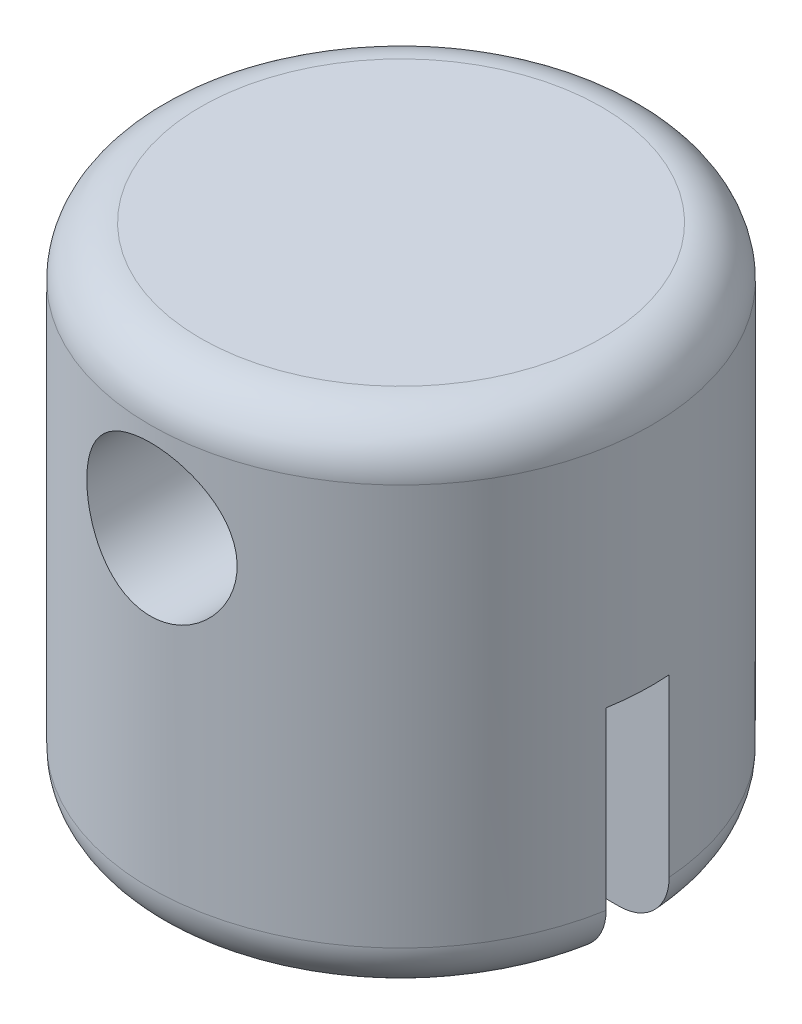
ISO-10303-21;
HEADER;
FILE_DESCRIPTION(('STEP AP214'),'2;1');
FILE_NAME('part.step','',(''),(''),'','','');
FILE_SCHEMA(('AUTOMOTIVE_DESIGN { 1 0 10303 214 1 1 1 1 }'));
ENDSEC;
DATA;
#1=APPLICATION_CONTEXT('core data for automotive mechanical design processes');
#2=APPLICATION_PROTOCOL_DEFINITION('international standard','automotive_design',2000,#1);
#3=PRODUCT_CONTEXT('',#1,'mechanical');
#4=PRODUCT('Part','Part','',(#3));
#5=PRODUCT_RELATED_PRODUCT_CATEGORY('part','',(#4));
#6=PRODUCT_DEFINITION_FORMATION('','',#4);
#7=PRODUCT_DEFINITION_CONTEXT('part definition',#1,'design');
#8=PRODUCT_DEFINITION('design','',#6,#7);
#9=PRODUCT_DEFINITION_SHAPE('','',#8);
#10=(LENGTH_UNIT() NAMED_UNIT(*) SI_UNIT(.MILLI.,.METRE.));
#11=(NAMED_UNIT(*) PLANE_ANGLE_UNIT() SI_UNIT($,.RADIAN.));
#12=(NAMED_UNIT(*) SI_UNIT($,.STERADIAN.) SOLID_ANGLE_UNIT());
#13=UNCERTAINTY_MEASURE_WITH_UNIT(LENGTH_MEASURE(1.E-05),#10,'distance_accuracy_value','');
#14=(GEOMETRIC_REPRESENTATION_CONTEXT(3) GLOBAL_UNCERTAINTY_ASSIGNED_CONTEXT((#13)) GLOBAL_UNIT_ASSIGNED_CONTEXT((#10,
#11,#12)) REPRESENTATION_CONTEXT('',''));
#15=CARTESIAN_POINT('',(0.,0.,0.));
#16=DIRECTION('',(0.,0.,1.));
#17=DIRECTION('',(1.,0.,0.));
#18=AXIS2_PLACEMENT_3D('',#15,#16,#17);
#19=CARTESIAN_POINT('',(0.,0.,0.));
#20=DIRECTION('',(0.,1.,0.));
#21=DIRECTION('',(0.,0.,1.));
#22=AXIS2_PLACEMENT_3D('',#19,#20,#21);
#23=PLANE('',#22);
#24=DIRECTION('',(1.,0.,0.));
#25=VECTOR('',#24,1.);
#26=CARTESIAN_POINT('',(0.,0.,2.12804942041903));
#27=LINE('',#26,#25);
#28=CARTESIAN_POINT('',(-9.93463666493417,0.,2.12804942041903));
#29=VERTEX_POINT('',#28);
#30=CARTESIAN_POINT('',(9.93463666493417,0.,2.12804942041903));
#31=VERTEX_POINT('',#30);
#32=EDGE_CURVE('E122',#29,#31,#27,.T.);
#33=ORIENTED_EDGE('',*,*,#32,.T.);
#34=CARTESIAN_POINT('',(0.,0.,0.));
#35=DIRECTION('',(0.,1.,0.));
#36=DIRECTION('',(0.,0.,1.));
#37=AXIS2_PLACEMENT_3D('',#34,#35,#36);
#38=CIRCLE('',#37,10.16);
#39=EDGE_CURVE('E183',#31,#29,#38,.F.);
#40=ORIENTED_EDGE('',*,*,#39,.T.);
#41=EDGE_LOOP('',(#33,#40));
#42=FACE_BOUND('',#41,.T.);
#43=ADVANCED_FACE('F45',(#42),#23,.F.);
#44=CARTESIAN_POINT('',(0.,25.4,0.));
#45=DIRECTION('',(0.,-1.,0.));
#46=DIRECTION('',(0.,0.,-1.));
#47=AXIS2_PLACEMENT_3D('',#44,#45,#46);
#48=CYLINDRICAL_SURFACE('',#47,12.7);
#49=CARTESIAN_POINT('',(0.,22.86,0.));
#50=DIRECTION('',(0.,1.,0.));
#51=DIRECTION('',(0.,0.,1.));
#52=AXIS2_PLACEMENT_3D('',#49,#50,#51);
#53=CIRCLE('',#52,12.7);
#54=CARTESIAN_POINT('',(0.,22.86,12.7));
#55=VERTEX_POINT('',#54);
#56=EDGE_CURVE('E229',#55,#55,#53,.F.);
#57=ORIENTED_EDGE('',*,*,#56,.T.);
#58=EDGE_LOOP('',(#57));
#59=FACE_BOUND('',#58,.T.);
#60=DIRECTION('',(0.,-1.,0.));
#61=VECTOR('',#60,1.);
#62=CARTESIAN_POINT('',(-12.5204395156182,25.4,2.12804942041903));
#63=LINE('',#62,#61);
#64=CARTESIAN_POINT('',(-12.5204395156182,11.43,2.12804942041903));
#65=VERTEX_POINT('',#64);
#66=CARTESIAN_POINT('',(-12.5204395156182,2.54,2.12804942041903));
#67=VERTEX_POINT('',#66);
#68=EDGE_CURVE('E135',#65,#67,#63,.T.);
#69=ORIENTED_EDGE('',*,*,#68,.T.);
#70=CARTESIAN_POINT('',(0.,2.54,0.));
#71=DIRECTION('',(0.,1.,0.));
#72=DIRECTION('',(0.,0.,1.));
#73=AXIS2_PLACEMENT_3D('',#70,#71,#72);
#74=CIRCLE('',#73,12.7);
#75=CARTESIAN_POINT('',(12.5204395156182,2.54,2.12804942041903));
#76=VERTEX_POINT('',#75);
#77=EDGE_CURVE('E227',#67,#76,#74,.T.);
#78=ORIENTED_EDGE('',*,*,#77,.T.);
#79=DIRECTION('',(0.,-1.,0.));
#80=VECTOR('',#79,1.);
#81=CARTESIAN_POINT('',(12.5204395156182,25.4,2.12804942041903));
#82=LINE('',#81,#80);
#83=CARTESIAN_POINT('',(12.5204395156182,11.43,2.12804942041903));
#84=VERTEX_POINT('',#83);
#85=EDGE_CURVE('E132',#76,#84,#82,.F.);
#86=ORIENTED_EDGE('',*,*,#85,.T.);
#87=CARTESIAN_POINT('',(0.,11.43,0.));
#88=DIRECTION('',(0.,1.,0.));
#89=DIRECTION('',(0.,0.,1.));
#90=AXIS2_PLACEMENT_3D('',#87,#88,#89);
#91=CIRCLE('',#90,12.7);
#92=CARTESIAN_POINT('',(12.6666369226851,11.43,-0.919950579580974));
#93=VERTEX_POINT('',#92);
#94=EDGE_CURVE('E121',#84,#93,#91,.T.);
#95=ORIENTED_EDGE('',*,*,#94,.T.);
#96=DIRECTION('',(0.,-1.,0.));
#97=VECTOR('',#96,1.);
#98=CARTESIAN_POINT('',(12.6666369226851,25.4,-0.919950579580974));
#99=LINE('',#98,#97);
#100=CARTESIAN_POINT('',(12.6666369226851,2.54,-0.919950579580974));
#101=VERTEX_POINT('',#100);
#102=EDGE_CURVE('E109',#93,#101,#99,.T.);
#103=ORIENTED_EDGE('',*,*,#102,.T.);
#104=CARTESIAN_POINT('',(0.,2.54,0.));
#105=DIRECTION('',(0.,1.,0.));
#106=DIRECTION('',(0.,0.,1.));
#107=AXIS2_PLACEMENT_3D('',#104,#105,#106);
#108=CIRCLE('',#107,12.7);
#109=CARTESIAN_POINT('',(-12.6666369226851,2.54,-0.919950579580974));
#110=VERTEX_POINT('',#109);
#111=EDGE_CURVE('E106',#101,#110,#108,.T.);
#112=ORIENTED_EDGE('',*,*,#111,.T.);
#113=DIRECTION('',(0.,-1.,0.));
#114=VECTOR('',#113,1.);
#115=CARTESIAN_POINT('',(-12.6666369226851,25.4,-0.919950579580974));
#116=LINE('',#115,#114);
#117=CARTESIAN_POINT('',(-12.6666369226851,11.43,-0.919950579580974));
#118=VERTEX_POINT('',#117);
#119=EDGE_CURVE('E98',#110,#118,#116,.F.);
#120=ORIENTED_EDGE('',*,*,#119,.T.);
#121=EDGE_CURVE('E103',#118,#65,#91,.T.);
#122=ORIENTED_EDGE('',*,*,#121,.T.);
#123=EDGE_LOOP('',(#69,#78,#86,#95,#103,#112,#120,#122));
#124=FACE_BOUND('',#123,.T.);
#125=CARTESIAN_POINT('',(-3.81,18.2861297285999,12.1150278579952));
#126=CARTESIAN_POINT('',(-3.80999739989923,18.0773555768241,12.1150300174878));
#127=CARTESIAN_POINT('',(-3.79278154744585,17.8685556992736,12.1204835113164));
#128=CARTESIAN_POINT('',(-3.72455044894699,17.457060394637,12.1416210888876));
#129=CARTESIAN_POINT('',(-3.67352390956876,17.2543670308864,12.1573085909325));
#130=CARTESIAN_POINT('',(-3.53955993305698,16.8611015187896,12.1969810031367));
#131=CARTESIAN_POINT('',(-3.45667557061381,16.6705098213319,12.2209521062625));
#132=CARTESIAN_POINT('',(-3.26152311671537,16.3058900162519,12.2744720867078));
#133=CARTESIAN_POINT('',(-3.14925062648113,16.1318643935415,12.3040217988418));
#134=CARTESIAN_POINT('',(-2.89470475519733,15.7998090965334,12.3664182995186));
#135=CARTESIAN_POINT('',(-2.75166346226549,15.6423811478164,12.3993353311156));
#136=CARTESIAN_POINT('',(-2.44128604345218,15.3533493322408,12.4641574931936));
#137=CARTESIAN_POINT('',(-2.27394679947122,15.2217487848573,12.4960624931617));
#138=CARTESIAN_POINT('',(-1.91544305199597,14.9854944710234,12.5560636503165));
#139=CARTESIAN_POINT('',(-1.72385741419297,14.8814542305152,12.5840673982971));
#140=CARTESIAN_POINT('',(-1.32492659923816,14.7073020906313,12.6322946723854));
#141=CARTESIAN_POINT('',(-1.11758483210529,14.637182873962,12.6525198762532));
#142=CARTESIAN_POINT('',(-0.699322585682307,14.5348545258301,12.6824142084912));
#143=CARTESIAN_POINT('',(-0.488674153342656,14.5016183043621,12.6923687571812));
#144=CARTESIAN_POINT('',(-0.0645714323232576,14.470751723998,12.7016053181343));
#145=CARTESIAN_POINT('',(0.148882257607943,14.473113886519,12.7008895720356));
#146=CARTESIAN_POINT('',(0.565330737764399,14.5126876146992,12.6890679369684));
#147=CARTESIAN_POINT('',(0.768442119808979,14.548786920877,12.678293673213));
#148=CARTESIAN_POINT('',(1.16557860214405,14.6529933220255,12.6479686616604));
#149=CARTESIAN_POINT('',(1.35960312616013,14.7211024439945,12.628417358067));
#150=CARTESIAN_POINT('',(1.73570220893215,14.8881482680829,12.5822766130667));
#151=CARTESIAN_POINT('',(1.91761126432357,14.9874347837297,12.5556078497802));
#152=CARTESIAN_POINT('',(2.26254227140962,15.2137402737684,12.4980608724691));
#153=CARTESIAN_POINT('',(2.42555972817672,15.34076582753,12.4671816604299));
#154=CARTESIAN_POINT('',(2.73471762308413,15.6247120155061,12.4031133823679));
#155=CARTESIAN_POINT('',(2.8799652342129,15.7825963029244,12.3698811610455));
#156=CARTESIAN_POINT('',(3.14217434911746,16.1208051740517,12.3058930892621));
#157=CARTESIAN_POINT('',(3.25913304188664,16.3011319851299,12.2751374850994));
#158=CARTESIAN_POINT('',(3.46237548150279,16.6814579804596,12.2193787407683));
#159=CARTESIAN_POINT('',(3.54835432656109,16.8816292249542,12.1944335899828));
#160=CARTESIAN_POINT('',(3.68511741703439,17.2945320379088,12.1538083690401));
#161=CARTESIAN_POINT('',(3.73591314384958,17.5072594842545,12.1381252766173));
#162=CARTESIAN_POINT('',(3.79919916518518,17.930738924908,12.1184631787762));
#163=CARTESIAN_POINT('',(3.81304663806225,18.1412690172988,12.114069718344));
#164=CARTESIAN_POINT('',(3.80583305971491,18.5616508946169,12.1163382879101));
#165=CARTESIAN_POINT('',(3.7847768950305,18.7715027703742,12.122998770347));
#166=CARTESIAN_POINT('',(3.70956239478568,19.1789102086481,12.1462179873244));
#167=CARTESIAN_POINT('',(3.65627822035485,19.3766435858299,12.1625150832981));
#168=CARTESIAN_POINT('',(3.51913387479734,19.7603500232693,12.2029001872652));
#169=CARTESIAN_POINT('',(3.435268982706,19.9463212625168,12.2269893981183));
#170=CARTESIAN_POINT('',(3.2367695283912,20.3067440873433,12.2810482095876));
#171=CARTESIAN_POINT('',(3.12136952998734,20.4807525199039,12.3111582851735));
#172=CARTESIAN_POINT('',(2.86398466064974,20.8074305182991,12.3735644234329));
#173=CARTESIAN_POINT('',(2.72199342658637,20.9600949613364,12.4058610081419));
#174=CARTESIAN_POINT('',(2.40907603653375,21.2456879593694,12.4704762921234));
#175=CARTESIAN_POINT('',(2.23726010727789,21.3776542262269,12.5027498246003));
#176=CARTESIAN_POINT('',(1.87315293285923,21.6109051492104,12.5624552344157));
#177=CARTESIAN_POINT('',(1.68086270518162,21.7121913290449,12.5898873521718));
#178=CARTESIAN_POINT('',(1.28253618195127,21.8802298062434,12.6366516500639));
#179=CARTESIAN_POINT('',(1.07661613997612,21.9472400496437,12.6560441169941));
#180=CARTESIAN_POINT('',(0.655751714921654,22.0454844625816,12.6848102817594));
#181=CARTESIAN_POINT('',(0.44080993208109,22.0767288681089,12.6941868460405));
#182=CARTESIAN_POINT('',(0.0168964708621774,22.1017762604984,12.7016902196674));
#183=CARTESIAN_POINT('',(-0.191986354878929,22.0969747749359,12.7002363498271));
#184=CARTESIAN_POINT('',(-0.605839482157618,22.0534027820521,12.6872305174124));
#185=CARTESIAN_POINT('',(-0.810810004860309,22.0146342007594,12.6756791273954));
#186=CARTESIAN_POINT('',(-1.20887696512492,21.9050921086451,12.6438956762999));
#187=CARTESIAN_POINT('',(-1.40207727547206,21.8346667497521,12.6237581636761));
#188=CARTESIAN_POINT('',(-1.77402042389068,21.664121665751,12.5768847532079));
#189=CARTESIAN_POINT('',(-1.95276087997023,21.5639970608706,12.5501477711507));
#190=CARTESIAN_POINT('',(-2.29692680674642,21.3331811467301,12.4918207320142));
#191=CARTESIAN_POINT('',(-2.46174323518812,21.2016142964074,12.460102763772));
#192=CARTESIAN_POINT('',(-2.76742543122557,20.9132253422253,12.3957978452797));
#193=CARTESIAN_POINT('',(-2.90828427641457,20.7563959643037,12.3632106470062));
#194=CARTESIAN_POINT('',(-3.16626924259787,20.4163241517236,12.2997132877024));
#195=CARTESIAN_POINT('',(-3.28256289775701,20.2324338031167,12.2688820571553));
#196=CARTESIAN_POINT('',(-3.48244956353535,19.8468195863613,12.2136547054725));
#197=CARTESIAN_POINT('',(-3.56605828713021,19.645104344689,12.1892554940455));
#198=CARTESIAN_POINT('',(-3.69066934035746,19.2519890322931,12.1520665449104));
#199=CARTESIAN_POINT('',(-3.7352950188908,19.061823765388,12.1383083330253));
#200=CARTESIAN_POINT('',(-3.79495859840714,18.6764890634679,12.1197888818919));
#201=CARTESIAN_POINT('',(-3.8100024309333,18.481320639603,12.1150258390033));
#202=CARTESIAN_POINT('',(-3.81,18.2861297285999,12.1150278579952));
#203=B_SPLINE_CURVE_WITH_KNOTS('',3,(#125,#126,#127,#128,#129,#130,#131,#132,#133,#134,#135,
#136,#137,#138,#139,#140,#141,#142,#143,#144,#145,#146,#147,#148,#149,#150,#151,#152,#153,#154,
#155,#156,#157,#158,#159,#160,#161,#162,#163,#164,#165,#166,#167,#168,#169,#170,#171,#172,#173,
#174,#175,#176,#177,#178,#179,#180,#181,#182,#183,#184,#185,#186,#187,#188,#189,#190,#191,#192,
#193,#194,#195,#196,#197,#198,#199,#200,#201,#202),.UNSPECIFIED.,.T.,.F.,(4,2,2,2,2,2,2,2,2,2,2,
2,2,2,2,2,2,2,2,2,2,2,2,2,2,2,2,2,2,2,2,2,2,2,2,2,2,2,4),(0.,0.625602421425477,1.25141390989006,
1.87618729274413,2.50105424444006,3.14383801020279,3.78670433593033,4.44286485755057,
5.09888377193207,5.73613635979876,6.37325507417658,6.99008320016835,7.60695039161555,
8.23100231712617,8.85520242140709,9.50346453439125,10.1517910372933,10.8063344514857,
11.4606641660278,12.09060525214,12.7204581533938,13.3339483115121,13.9475332186292,
14.5775865880246,15.2077909186608,15.8617794550214,16.5157355061009,17.16469495215,
17.8134686230369,18.4372581194111,19.0610122474791,19.6780682606205,20.2952257161472,
20.9321305272502,21.5692190568654,22.2252956476763,22.881056446783,23.4660733080779,
24.0509728539512),.UNSPECIFIED.);
#204=CARTESIAN_POINT('',(-3.81,18.2861297285999,12.1150278579952));
#205=VERTEX_POINT('',#204);
#206=EDGE_CURVE('E138',#205,#205,#203,.T.);
#207=ORIENTED_EDGE('',*,*,#206,.F.);
#208=EDGE_LOOP('',(#207));
#209=FACE_BOUND('',#208,.T.);
#210=CARTESIAN_POINT('',(0.,22.0961297286,-12.7));
#211=CARTESIAN_POINT('',(0.209013076393382,22.0961271949883,-12.699998202964));
#212=CARTESIAN_POINT('',(0.418051788612885,22.0788733149951,-12.6947908586264));
#213=CARTESIAN_POINT('',(0.830041838274397,22.0104774888758,-12.6745264820797));
#214=CARTESIAN_POINT('',(1.03299134120501,21.9593254352207,-12.6594665120982));
#215=CARTESIAN_POINT('',(1.4268010776965,21.8249948456479,-12.6211470335466));
#216=CARTESIAN_POINT('',(1.61767866556425,21.7418635597678,-12.5978996263608));
#217=CARTESIAN_POINT('',(1.98278541987495,21.5461280522381,-12.5456215746362));
#218=CARTESIAN_POINT('',(2.15701236737296,21.4335199098156,-12.5165901608785));
#219=CARTESIAN_POINT('',(2.48887436484671,21.1786207496194,-12.4549087246965));
#220=CARTESIAN_POINT('',(2.64596390096063,21.0356374988497,-12.4221845448887));
#221=CARTESIAN_POINT('',(2.93433299145242,20.7255222846281,-12.3572481889452));
#222=CARTESIAN_POINT('',(3.065608202717,20.5583862658025,-12.3250360998023));
#223=CARTESIAN_POINT('',(3.30149295818217,20.2000940158844,-12.2639864954418));
#224=CARTESIAN_POINT('',(3.40543664916422,20.0084822376835,-12.2352411292624));
#225=CARTESIAN_POINT('',(3.57940342727891,19.609497022855,-12.1854879580084));
#226=CARTESIAN_POINT('',(3.64943465996732,19.4021273850229,-12.1644782951581));
#227=CARTESIAN_POINT('',(3.75162149553935,18.9836384526286,-12.1333481192962));
#228=CARTESIAN_POINT('',(3.78478278436081,18.7727867591855,-12.1229391608431));
#229=CARTESIAN_POINT('',(3.81542875761267,18.3482755118094,-12.1133308596441));
#230=CARTESIAN_POINT('',(3.81292208613139,18.1346166507299,-12.1141288009185));
#231=CARTESIAN_POINT('',(3.77309322087522,17.7187346007344,-12.1265884993216));
#232=CARTESIAN_POINT('',(3.7370310136722,17.5163770126799,-12.1378570704182));
#233=CARTESIAN_POINT('',(3.63315047884722,17.1207274714654,-12.1693522482071));
#234=CARTESIAN_POINT('',(3.56532901719768,16.9274364150691,-12.1895797389617));
#235=CARTESIAN_POINT('',(3.39892707700351,16.5523248404617,-12.2370274201043));
#236=CARTESIAN_POINT('',(3.29993795013992,16.3706977353536,-12.2643396093452));
#237=CARTESIAN_POINT('',(3.07429465375255,16.0262103926941,-12.3228350698016));
#238=CARTESIAN_POINT('',(2.94763377966574,15.863354717889,-12.3540192783736));
#239=CARTESIAN_POINT('',(2.66398478544487,15.5538868040644,-12.4183396869676));
#240=CARTESIAN_POINT('',(2.50595106496611,15.4082369219646,-12.4515030194866));
#241=CARTESIAN_POINT('',(2.16728867865747,15.1452826090768,-12.5148909992068));
#242=CARTESIAN_POINT('',(1.98665859172665,15.0279799624273,-12.5451154613676));
#243=CARTESIAN_POINT('',(1.60618179739072,14.8244655255395,-12.5994962657645));
#244=CARTESIAN_POINT('',(1.40621448435979,14.7384672373253,-12.6236106091752));
#245=CARTESIAN_POINT('',(0.993763355632937,14.6016067697469,-12.6627514545384));
#246=CARTESIAN_POINT('',(0.781283049037536,14.5507347901274,-12.6777804911498));
#247=CARTESIAN_POINT('',(0.358018696377561,14.4871731967355,-12.6966564619459));
#248=CARTESIAN_POINT('',(0.147447247907014,14.4731793006639,-12.7008852006119));
#249=CARTESIAN_POINT('',(-0.273048998791394,14.4801153841086,-12.6988042503407));
#250=CARTESIAN_POINT('',(-0.482973879594584,14.5010407015146,-12.692495968215));
#251=CARTESIAN_POINT('',(-0.891295157486631,14.5761666408232,-12.6702997034739));
#252=CARTESIAN_POINT('',(-1.08984484243999,14.6296051330554,-12.6546312769051));
#253=CARTESIAN_POINT('',(-1.47511678294449,14.7673235398566,-12.615528435175));
#254=CARTESIAN_POINT('',(-1.66183761364498,14.8516071616361,-12.5920930865558));
#255=CARTESIAN_POINT('',(-2.02295046123107,15.050812768922,-12.5392092205234));
#256=CARTESIAN_POINT('',(-2.19695731854716,15.1663984546078,-12.5096341330729));
#257=CARTESIAN_POINT('',(-2.52354920226958,15.4241206038941,-12.4478661066145));
#258=CARTESIAN_POINT('',(-2.67612884218409,15.5662637227946,-12.4156725125527));
#259=CARTESIAN_POINT('',(-2.96127791159607,15.8791934918582,-12.3508305654727));
#260=CARTESIAN_POINT('',(-3.09291942328012,16.0508328930604,-12.318208155832));
#261=CARTESIAN_POINT('',(-3.32559647483277,16.4144746936941,-12.25744348707));
#262=CARTESIAN_POINT('',(-3.42663281726885,16.606476558977,-12.2293011104766));
#263=CARTESIAN_POINT('',(-3.59454061702981,17.0047822563877,-12.1810066161741));
#264=CARTESIAN_POINT('',(-3.66157121220007,17.211014242406,-12.1608173810535));
#265=CARTESIAN_POINT('',(-3.75975196270489,17.6325571696827,-12.1308264969947));
#266=CARTESIAN_POINT('',(-3.79091441406468,17.8478649733889,-12.1210212883812));
#267=CARTESIAN_POINT('',(-3.81563840591811,18.2718079853065,-12.1132593007578));
#268=CARTESIAN_POINT('',(-3.81071260482176,18.4803474022655,-12.114825842695));
#269=CARTESIAN_POINT('',(-3.76701063828535,18.8934795512375,-12.1284847903808));
#270=CARTESIAN_POINT('',(-3.72823582836747,19.0980724409585,-12.140576774626));
#271=CARTESIAN_POINT('',(-3.61891297563031,19.4950310423944,-12.1736043978434));
#272=CARTESIAN_POINT('',(-3.54876545788095,19.687517038491,-12.1944283556327));
#273=CARTESIAN_POINT('',(-3.37900028087527,20.0581415232046,-12.2425530841269));
#274=CARTESIAN_POINT('',(-3.27937698105667,20.2362772574095,-12.2698550942905));
#275=CARTESIAN_POINT('',(-3.04923860064923,20.5801640445767,-12.3291009812628));
#276=CARTESIAN_POINT('',(-2.91773041276215,20.7452275822008,-12.361177720173));
#277=CARTESIAN_POINT('',(-2.62934283959635,21.0514340743025,-12.4257135394181));
#278=CARTESIAN_POINT('',(-2.4724568715216,21.1925708028482,-12.4581727169238));
#279=CARTESIAN_POINT('',(-2.13224303594548,21.4510291958292,-12.520953788898));
#280=CARTESIAN_POINT('',(-1.94827622990815,21.5675340036128,-12.5511854580491));
#281=CARTESIAN_POINT('',(-1.56245908991815,21.7677970601562,-12.6050212835767));
#282=CARTESIAN_POINT('',(-1.36061717461734,21.8515706248172,-12.6286285382489));
#283=CARTESIAN_POINT('',(-0.967124590144414,21.9764837287579,-12.6644952442205));
#284=CARTESIAN_POINT('',(-0.776698883363754,22.0212293777234,-12.6776994954792));
#285=CARTESIAN_POINT('',(-0.390855695886178,22.0810510827136,-12.69545199016));
#286=CARTESIAN_POINT('',(-0.195439055039674,22.0961320976702,-12.7000016803304));
#287=CARTESIAN_POINT('',(0.,22.0961297286,-12.7));
#288=B_SPLINE_CURVE_WITH_KNOTS('',3,(#210,#211,#212,#213,#214,#215,#216,#217,#218,#219,#220,
#221,#222,#223,#224,#225,#226,#227,#228,#229,#230,#231,#232,#233,#234,#235,#236,#237,#238,#239,
#240,#241,#242,#243,#244,#245,#246,#247,#248,#249,#250,#251,#252,#253,#254,#255,#256,#257,#258,
#259,#260,#261,#262,#263,#264,#265,#266,#267,#268,#269,#270,#271,#272,#273,#274,#275,#276,#277,
#278,#279,#280,#281,#282,#283,#284,#285,#286,#287),.UNSPECIFIED.,.T.,.F.,(4,2,2,2,2,2,2,2,2,2,2,
2,2,2,2,2,2,2,2,2,2,2,2,2,2,2,2,2,2,2,2,2,2,2,2,2,2,2,4),(0.,0.626321337176031,1.25282951070884,
1.87841553780422,2.50408481760826,3.14593231488406,3.78788770713128,4.44427561750437,
5.10050578939788,5.73836010965761,6.37605984930487,6.99074082412097,7.60548246891323,
8.22864563175684,8.85195994802731,9.50130444282343,10.1506897958892,10.8044245907949,
11.4579769196317,12.088083759739,12.7181064801783,13.3339013657311,13.9497702866807,
14.5798871648539,15.2101621628048,15.8633261681996,16.5164730440181,17.1665344997618,
17.8163730402912,18.4391339489195,19.0618699195205,19.6768730263449,20.2919938979647,
20.9295219123861,21.5672155625124,22.2235521024953,22.8795811546348,23.4653249751495,
24.0509708706172),.UNSPECIFIED.);
#289=CARTESIAN_POINT('',(0.,22.0961297286,-12.7));
#290=VERTEX_POINT('',#289);
#291=EDGE_CURVE('E147',#290,#290,#288,.T.);
#292=ORIENTED_EDGE('',*,*,#291,.F.);
#293=EDGE_LOOP('',(#292));
#294=FACE_BOUND('',#293,.T.);
#295=ADVANCED_FACE('F101',(#59,#124,#209,#294),#48,.T.);
#296=CARTESIAN_POINT('',(0.,25.4,0.));
#297=DIRECTION('',(0.,1.,0.));
#298=DIRECTION('',(0.,0.,1.));
#299=AXIS2_PLACEMENT_3D('',#296,#297,#298);
#300=PLANE('',#299);
#301=CARTESIAN_POINT('',(0.,25.4,0.));
#302=DIRECTION('',(0.,1.,0.));
#303=DIRECTION('',(0.,0.,1.));
#304=AXIS2_PLACEMENT_3D('',#301,#302,#303);
#305=CIRCLE('',#304,10.16);
#306=CARTESIAN_POINT('',(0.,25.4,10.16));
#307=VERTEX_POINT('',#306);
#308=EDGE_CURVE('E12',#307,#307,#305,.T.);
#309=ORIENTED_EDGE('',*,*,#308,.T.);
#310=EDGE_LOOP('',(#309));
#311=FACE_BOUND('',#310,.T.);
#312=ADVANCED_FACE('F165',(#311),#300,.T.);
#313=DIRECTION('',(-1.,0.,0.));
#314=VECTOR('',#313,1.);
#315=CARTESIAN_POINT('',(0.,0.,-0.919950579580974));
#316=LINE('',#315,#314);
#317=CARTESIAN_POINT('',(10.11826521352,0.,-0.919950579580974));
#318=VERTEX_POINT('',#317);
#319=CARTESIAN_POINT('',(-10.11826521352,0.,-0.919950579580974));
#320=VERTEX_POINT('',#319);
#321=EDGE_CURVE('E187',#318,#320,#316,.T.);
#322=ORIENTED_EDGE('',*,*,#321,.T.);
#323=CARTESIAN_POINT('',(0.,0.,0.));
#324=DIRECTION('',(0.,1.,0.));
#325=DIRECTION('',(0.,0.,1.));
#326=AXIS2_PLACEMENT_3D('',#323,#324,#325);
#327=CIRCLE('',#326,10.16);
#328=EDGE_CURVE('E54',#320,#318,#327,.F.);
#329=ORIENTED_EDGE('',*,*,#328,.T.);
#330=EDGE_LOOP('',(#322,#329));
#331=FACE_BOUND('',#330,.T.);
#332=ADVANCED_FACE('F160',(#331),#23,.F.);
#333=CARTESIAN_POINT('',(0.,18.2861297285999,25.4));
#334=DIRECTION('',(0.,0.,-1.));
#335=DIRECTION('',(-1.,0.,0.));
#336=AXIS2_PLACEMENT_3D('',#333,#334,#335);
#337=CYLINDRICAL_SURFACE('',#336,3.81);
#338=ORIENTED_EDGE('',*,*,#206,.T.);
#339=EDGE_LOOP('',(#338));
#340=FACE_BOUND('',#339,.T.);
#341=ORIENTED_EDGE('',*,*,#291,.T.);
#342=EDGE_LOOP('',(#341));
#343=FACE_BOUND('',#342,.T.);
#344=ADVANCED_FACE('F155',(#340,#343),#337,.F.);
#345=CARTESIAN_POINT('',(-25.4,11.43,2.12804942041903));
#346=DIRECTION('',(0.,1.,0.));
#347=DIRECTION('',(0.,0.,1.));
#348=AXIS2_PLACEMENT_3D('',#345,#346,#347);
#349=PLANE('',#348);
#350=DIRECTION('',(1.,0.,0.));
#351=VECTOR('',#350,1.);
#352=CARTESIAN_POINT('',(-25.4,11.43,2.12804942041903));
#353=LINE('',#352,#351);
#354=EDGE_CURVE('E110',#65,#84,#353,.T.);
#355=ORIENTED_EDGE('',*,*,#354,.F.);
#356=ORIENTED_EDGE('',*,*,#121,.F.);
#357=DIRECTION('',(1.,0.,0.));
#358=VECTOR('',#357,1.);
#359=CARTESIAN_POINT('',(-25.4,11.43,-0.919950579580974));
#360=LINE('',#359,#358);
#361=EDGE_CURVE('E117',#118,#93,#360,.T.);
#362=ORIENTED_EDGE('',*,*,#361,.T.);
#363=ORIENTED_EDGE('',*,*,#94,.F.);
#364=EDGE_LOOP('',(#355,#356,#362,#363));
#365=FACE_BOUND('',#364,.T.);
#366=ADVANCED_FACE('F115',(#365),#349,.F.);
#367=CARTESIAN_POINT('',(-25.4,0.,2.12804942041903));
#368=DIRECTION('',(0.,0.,1.));
#369=DIRECTION('',(1.,0.,0.));
#370=AXIS2_PLACEMENT_3D('',#367,#368,#369);
#371=PLANE('',#370);
#372=ORIENTED_EDGE('',*,*,#85,.F.);
#373=CARTESIAN_POINT('',(12.5204395156182,2.54,2.12804942041903));
#374=CARTESIAN_POINT('',(12.520446857704,2.46933717569974,2.12804942041903));
#375=CARTESIAN_POINT('',(12.5174485172467,2.39867783695554,2.12804942041903));
#376=CARTESIAN_POINT('',(12.5054971774979,2.25786941525476,2.12804942041903));
#377=CARTESIAN_POINT('',(12.4965446013589,2.18772029639626,2.12804942041903));
#378=CARTESIAN_POINT('',(12.4727545923468,2.04850213898583,2.12804942041903));
#379=CARTESIAN_POINT('',(12.4579236531324,1.97943199573928,2.12804942041903));
#380=CARTESIAN_POINT('',(12.4225045749717,1.84280447608885,2.12804942041903));
#381=CARTESIAN_POINT('',(12.4019164817206,1.77524708768265,2.12804942041903));
#382=CARTESIAN_POINT('',(12.3317023470921,1.57550940956632,2.12804942041903));
#383=CARTESIAN_POINT('',(12.2736138666325,1.44619046905937,2.12804942041903));
#384=CARTESIAN_POINT('',(12.1366967638741,1.19915687645706,2.12804942041903));
#385=CARTESIAN_POINT('',(12.0578698008858,1.08144129699844,2.12804942041903));
#386=CARTESIAN_POINT('',(11.8813011197648,0.860117003696426,2.12804942041903));
#387=CARTESIAN_POINT('',(11.7834604474539,0.756587144897122,2.12804942041903));
#388=CARTESIAN_POINT('',(11.5719796631203,0.567149294078631,2.12804942041903));
#389=CARTESIAN_POINT('',(11.4583366064308,0.481244593790422,2.12804942041903));
#390=CARTESIAN_POINT('',(11.2168585601527,0.328220164878699,2.12804942041903));
#391=CARTESIAN_POINT('',(11.0888504568473,0.261373940346723,2.12804942041903));
#392=CARTESIAN_POINT('',(10.8235719756781,0.149721527434422,2.12804942041903));
#393=CARTESIAN_POINT('',(10.686304033995,0.104909567554618,2.12804942041903));
#394=CARTESIAN_POINT('',(10.4461806098059,0.0477902058789278,2.12804942041903));
#395=CARTESIAN_POINT('',(10.3446210593723,0.0298662538160632,2.12804942041903));
#396=CARTESIAN_POINT('',(10.1402629296636,0.00597167573093124,2.12804942041903));
#397=CARTESIAN_POINT('',(10.0374664939177,-1.72742328106633E-05,2.12804942041903));
#398=CARTESIAN_POINT('',(9.93463666493417,0.,2.12804942041903));
#399=B_SPLINE_CURVE_WITH_KNOTS('',3,(#373,#374,#375,#376,#377,#378,#379,#380,#381,#382,#383,
#384,#385,#386,#387,#388,#389,#390,#391,#392,#393,#394,#395,#396,#397,#398),.UNSPECIFIED.,.F.,
.F.,(4,2,2,2,2,2,2,2,2,2,2,2,4),(0.,0.211918667518376,0.423822276120661,0.635492450404686,
0.847160944686027,1.27027810063695,1.69336141277401,2.11870860605882,2.54413516637877,
2.97539060443019,3.40653302222739,3.7152548792491,4.02350238587808),.UNSPECIFIED.);
#400=EDGE_CURVE('E192',#76,#31,#399,.T.);
#401=ORIENTED_EDGE('',*,*,#400,.T.);
#402=ORIENTED_EDGE('',*,*,#32,.F.);
#403=CARTESIAN_POINT('',(-9.93463666493417,0.,2.12804942041903));
#404=CARTESIAN_POINT('',(-10.0084583152268,-6.29844547150247E-06,2.12804942041903));
#405=CARTESIAN_POINT('',(-10.0822786175365,0.00307713949356194,2.12804942041903));
#406=CARTESIAN_POINT('',(-10.2294068421552,0.0153935220991832,2.12804942041903));
#407=CARTESIAN_POINT('',(-10.3027147465117,0.0246266811493186,2.12804942041903));
#408=CARTESIAN_POINT('',(-10.4483018186809,0.0492122906576864,2.12804942041903));
#409=CARTESIAN_POINT('',(-10.5205810070104,0.0645646188970149,2.12804942041903));
#410=CARTESIAN_POINT('',(-10.6635701388003,0.101289645680071,2.12804942041903));
#411=CARTESIAN_POINT('',(-10.7342801337242,0.122662146469709,2.12804942041903));
#412=CARTESIAN_POINT('',(-10.9434226937121,0.195698896608148,2.12804942041903));
#413=CARTESIAN_POINT('',(-11.0788660928361,0.256282099503864,2.12804942041903));
#414=CARTESIAN_POINT('',(-11.337339218096,0.39957774309384,2.12804942041903));
#415=CARTESIAN_POINT('',(-11.4603742636564,0.482280645129495,2.12804942041903));
#416=CARTESIAN_POINT('',(-11.6889142576738,0.666375999336415,2.12804942041903));
#417=CARTESIAN_POINT('',(-11.7946292640964,0.767507195600845,2.12804942041903));
#418=CARTESIAN_POINT('',(-11.9872417078511,0.986384118984308,2.12804942041903));
#419=CARTESIAN_POINT('',(-12.0741357249972,1.10413285946498,2.12804942041903));
#420=CARTESIAN_POINT('',(-12.2250837986738,1.35072130998476,2.12804942041903));
#421=CARTESIAN_POINT('',(-12.2894969657696,1.47934151558971,2.12804942041903));
#422=CARTESIAN_POINT('',(-12.3954700890508,1.74562441646864,2.12804942041903));
#423=CARTESIAN_POINT('',(-12.437048532332,1.8832796955141,2.12804942041903));
#424=CARTESIAN_POINT('',(-12.484485062391,2.10831367484822,2.12804942041903));
#425=CARTESIAN_POINT('',(-12.4979611320461,2.19415898580971,2.12804942041903));
#426=CARTESIAN_POINT('',(-12.5159355822028,2.36665636103249,2.12804942041903));
#427=CARTESIAN_POINT('',(-12.5204471503246,2.45330705154772,2.12804942041903));
#428=CARTESIAN_POINT('',(-12.5204395156182,2.54,2.12804942041903));
#429=B_SPLINE_CURVE_WITH_KNOTS('',3,(#403,#404,#405,#406,#407,#408,#409,#410,#411,#412,#413,
#414,#415,#416,#417,#418,#419,#420,#421,#422,#423,#424,#425,#426,#427,#428),.UNSPECIFIED.,.F.,
.F.,(4,2,2,2,2,2,2,2,2,2,2,2,4),(0.,0.221397482383405,0.44280268324075,0.66420346216691,
0.885596969240905,1.32838921385636,1.77099082056377,2.20774703922742,2.64458255959473,
3.07408090554052,3.50323101314117,3.76349303716293,4.02337190710514),.UNSPECIFIED.);
#430=EDGE_CURVE('E194',#29,#67,#429,.T.);
#431=ORIENTED_EDGE('',*,*,#430,.T.);
#432=ORIENTED_EDGE('',*,*,#68,.F.);
#433=ORIENTED_EDGE('',*,*,#354,.T.);
#434=EDGE_LOOP('',(#372,#401,#402,#431,#432,#433));
#435=FACE_BOUND('',#434,.T.);
#436=ADVANCED_FACE('F162',(#435),#371,.F.);
#437=CARTESIAN_POINT('',(-25.4,0.,-0.919950579580974));
#438=DIRECTION('',(0.,0.,-1.));
#439=DIRECTION('',(-1.,0.,0.));
#440=AXIS2_PLACEMENT_3D('',#437,#438,#439);
#441=PLANE('',#440);
#442=ORIENTED_EDGE('',*,*,#119,.F.);
#443=CARTESIAN_POINT('',(-12.6666369226851,2.54,-0.919950579580974));
#444=CARTESIAN_POINT('',(-12.6666438609667,2.46870324787354,-0.919950579580974));
#445=CARTESIAN_POINT('',(-12.6636271398963,2.39740978522533,-0.919950579580974));
#446=CARTESIAN_POINT('',(-12.6516000509296,2.25533382346799,-0.919950579580974));
#447=CARTESIAN_POINT('',(-12.6425899962206,2.18455129785472,-0.919950579580974));
#448=CARTESIAN_POINT('',(-12.618639727791,2.04405168388789,-0.919950579580974));
#449=CARTESIAN_POINT('',(-12.6037043842187,1.97433376925282,-0.919950579580974));
#450=CARTESIAN_POINT('',(-12.5680260659227,1.83642109972173,-0.919950579580974));
#451=CARTESIAN_POINT('',(-12.5472831574976,1.76822632744725,-0.919950579580974));
#452=CARTESIAN_POINT('',(-12.4765143255996,1.56658725190874,-0.919950579580974));
#453=CARTESIAN_POINT('',(-12.417937961482,1.43602790662174,-0.919950579580974));
#454=CARTESIAN_POINT('',(-12.2797569600945,1.18667754426775,-0.919950579580974));
#455=CARTESIAN_POINT('',(-12.200155652223,1.06788466801697,-0.919950579580974));
#456=CARTESIAN_POINT('',(-12.022084252853,0.845181106997421,-0.919950579580974));
#457=CARTESIAN_POINT('',(-11.9235953727233,0.741285422767705,-0.919950579580974));
#458=CARTESIAN_POINT('',(-11.7105923054844,0.551438934636014,-0.919950579580974));
#459=CARTESIAN_POINT('',(-11.5960750065875,0.46549162335892,-0.919950579580974));
#460=CARTESIAN_POINT('',(-11.3539667740478,0.313748377675382,-0.919950579580974));
#461=CARTESIAN_POINT('',(-11.2263411767884,0.248007809040535,-0.919950579580974));
#462=CARTESIAN_POINT('',(-10.9619113803193,0.138839287946545,-0.919950579580974));
#463=CARTESIAN_POINT('',(-10.8251120410038,0.0953996252688192,-0.919950579580974));
#464=CARTESIAN_POINT('',(-10.5926486042755,0.042522776346439,-0.919950579580974));
#465=CARTESIAN_POINT('',(-10.4984108963548,0.026584371973547,-0.919950579580974));
#466=CARTESIAN_POINT('',(-10.3088830232673,0.00532418554775829,-0.919950579580974));
#467=CARTESIAN_POINT('',(-10.213594568737,-1.2848889941756E-05,-0.919950579580974));
#468=CARTESIAN_POINT('',(-10.11826521352,0.,-0.919950579580974));
#469=B_SPLINE_CURVE_WITH_KNOTS('',3,(#443,#444,#445,#446,#447,#448,#449,#450,#451,#452,#453,
#454,#455,#456,#457,#458,#459,#460,#461,#462,#463,#464,#465,#466,#467,#468),.UNSPECIFIED.,.F.,
.F.,(4,2,2,2,2,2,2,2,2,2,2,2,4),(0.,0.213820537441499,0.42762990236671,0.641263894711701,
0.854895448328278,1.28197737911325,1.7089917199783,2.13643306260786,2.56395750491531,
2.99264311663531,3.42110339445578,3.70727418441963,3.99303295616556),.UNSPECIFIED.);
#470=EDGE_CURVE('E61',#110,#320,#469,.T.);
#471=ORIENTED_EDGE('',*,*,#470,.T.);
#472=ORIENTED_EDGE('',*,*,#321,.F.);
#473=CARTESIAN_POINT('',(10.11826521352,0.,-0.919950579580974));
#474=CARTESIAN_POINT('',(10.1901353066059,-6.74553490267447E-06,-0.919950579580974));
#475=CARTESIAN_POINT('',(10.2620024934663,0.00302535783996846,-0.919950579580974));
#476=CARTESIAN_POINT('',(10.4052255427243,0.0151183641097118,-0.919950579580974));
#477=CARTESIAN_POINT('',(10.4765814218472,0.0241790688859086,-0.919950579580974));
#478=CARTESIAN_POINT('',(10.6182369494039,0.0482728705096079,-0.919950579580974));
#479=CARTESIAN_POINT('',(10.6885372287804,0.0633022392895443,-0.919950579580974));
#480=CARTESIAN_POINT('',(10.8276045504467,0.0992159904540654,-0.919950579580974));
#481=CARTESIAN_POINT('',(10.8963716171956,0.120100279363607,-0.919950579580974));
#482=CARTESIAN_POINT('',(11.0997181091989,0.191377716587233,-0.919950579580974));
#483=CARTESIAN_POINT('',(11.2313897472462,0.250403451903177,-0.919950579580974));
#484=CARTESIAN_POINT('',(11.4828199864564,0.389733401044855,-0.919950579580974));
#485=CARTESIAN_POINT('',(11.6025812173574,0.470032903355282,-0.919950579580974));
#486=CARTESIAN_POINT('',(11.8266112964822,0.649466052524451,-0.919950579580974));
#487=CARTESIAN_POINT('',(11.9309158911845,0.7485549947109,-0.919950579580974));
#488=CARTESIAN_POINT('',(12.1213616677812,0.962909205856624,-0.919950579580974));
#489=CARTESIAN_POINT('',(12.207499329149,1.07817760299875,-0.919950579580974));
#490=CARTESIAN_POINT('',(12.35887683343,1.32122076074887,-0.919950579580974));
#491=CARTESIAN_POINT('',(12.4241772035887,1.44895786479567,-0.919950579580974));
#492=CARTESIAN_POINT('',(12.5323143398746,1.71357200524715,-0.919950579580974));
#493=CARTESIAN_POINT('',(12.5751651742888,1.85044325684151,-0.919950579580974));
#494=CARTESIAN_POINT('',(12.6262752281502,2.08016033639179,-0.919950579580974));
#495=CARTESIAN_POINT('',(12.6414019521128,2.17153656560314,-0.919950579580974));
#496=CARTESIAN_POINT('',(12.6615811656467,2.35526217192919,-0.919950579580974));
#497=CARTESIAN_POINT('',(12.6666480261783,2.44760997111165,-0.919950579580974));
#498=CARTESIAN_POINT('',(12.6666369226851,2.54,-0.919950579580974));
#499=B_SPLINE_CURVE_WITH_KNOTS('',3,(#473,#474,#475,#476,#477,#478,#479,#480,#481,#482,#483,
#484,#485,#486,#487,#488,#489,#490,#491,#492,#493,#494,#495,#496,#497,#498),.UNSPECIFIED.,.F.,
.F.,(4,2,2,2,2,2,2,2,2,2,2,2,4),(0.,0.215540981899212,0.431074880798248,0.646474366981332,
0.861870414461684,1.29252150687099,1.72307730231222,2.15262126970237,2.58224840106155,
3.01061596395217,3.43871476279214,3.716060209042,3.9930091691485),.UNSPECIFIED.);
#500=EDGE_CURVE('E196',#318,#101,#499,.T.);
#501=ORIENTED_EDGE('',*,*,#500,.T.);
#502=ORIENTED_EDGE('',*,*,#102,.F.);
#503=ORIENTED_EDGE('',*,*,#361,.F.);
#504=EDGE_LOOP('',(#442,#471,#472,#501,#502,#503));
#505=FACE_BOUND('',#504,.T.);
#506=ADVANCED_FACE('F124',(#505),#441,.F.);
#507=CARTESIAN_POINT('',(0.,2.54,0.));
#508=DIRECTION('',(0.,1.,0.));
#509=DIRECTION('',(0.,0.,1.));
#510=AXIS2_PLACEMENT_3D('',#507,#508,#509);
#511=TOROIDAL_SURFACE('',#510,10.16,2.54);
#512=ORIENTED_EDGE('',*,*,#430,.F.);
#513=ORIENTED_EDGE('',*,*,#39,.F.);
#514=ORIENTED_EDGE('',*,*,#400,.F.);
#515=ORIENTED_EDGE('',*,*,#77,.F.);
#516=EDGE_LOOP('',(#512,#513,#514,#515));
#517=FACE_BOUND('',#516,.T.);
#518=ADVANCED_FACE('F190',(#517),#511,.T.);
#519=CARTESIAN_POINT('',(0.,2.54,0.));
#520=DIRECTION('',(0.,1.,0.));
#521=DIRECTION('',(0.,0.,1.));
#522=AXIS2_PLACEMENT_3D('',#519,#520,#521);
#523=TOROIDAL_SURFACE('',#522,10.16,2.54);
#524=ORIENTED_EDGE('',*,*,#500,.F.);
#525=ORIENTED_EDGE('',*,*,#328,.F.);
#526=ORIENTED_EDGE('',*,*,#470,.F.);
#527=ORIENTED_EDGE('',*,*,#111,.F.);
#528=EDGE_LOOP('',(#524,#525,#526,#527));
#529=FACE_BOUND('',#528,.T.);
#530=ADVANCED_FACE('F216',(#529),#523,.T.);
#531=CARTESIAN_POINT('',(0.,22.86,0.));
#532=DIRECTION('',(0.,1.,0.));
#533=DIRECTION('',(0.,0.,1.));
#534=AXIS2_PLACEMENT_3D('',#531,#532,#533);
#535=TOROIDAL_SURFACE('',#534,10.16,2.54);
#536=ORIENTED_EDGE('',*,*,#56,.F.);
#537=EDGE_LOOP('',(#536));
#538=FACE_BOUND('',#537,.T.);
#539=ORIENTED_EDGE('',*,*,#308,.F.);
#540=EDGE_LOOP('',(#539));
#541=FACE_BOUND('',#540,.T.);
#542=ADVANCED_FACE('F47',(#538,#541),#535,.T.);
#543=CLOSED_SHELL('',(#43,#295,#312,#332,#344,#366,#436,#506,#518,#530,#542));
#544=MANIFOLD_SOLID_BREP('B2',#543);
#545=ADVANCED_BREP_SHAPE_REPRESENTATION('',(#18,#544),#14);
#546=SHAPE_DEFINITION_REPRESENTATION(#9,#545);
ENDSEC;
END-ISO-10303-21;
